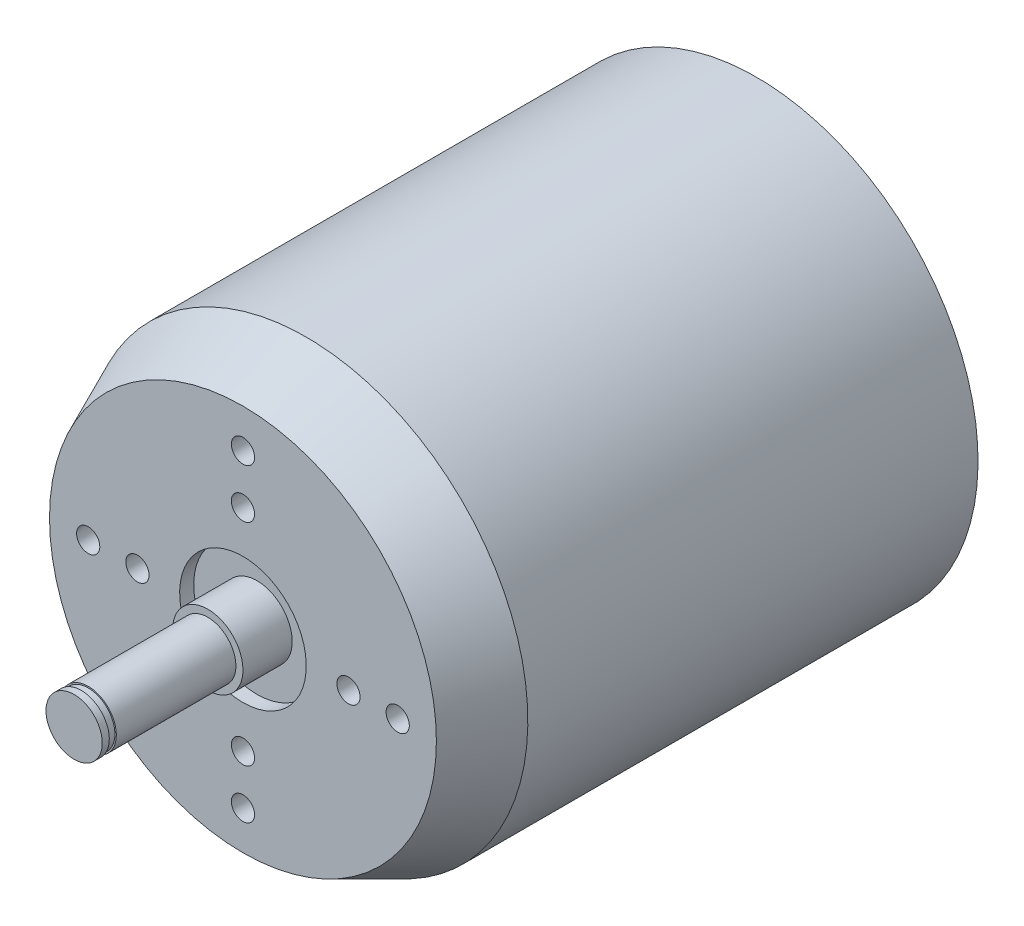
ISO-10303-21;
HEADER;
FILE_DESCRIPTION(('STEP AP214'),'2;1');
FILE_NAME('part.step','',(''),(''),'','','');
FILE_SCHEMA(('AUTOMOTIVE_DESIGN { 1 0 10303 214 1 1 1 1 }'));
ENDSEC;
DATA;
#1=APPLICATION_CONTEXT('core data for automotive mechanical design processes');
#2=APPLICATION_PROTOCOL_DEFINITION('international standard','automotive_design',2000,#1);
#3=PRODUCT_CONTEXT('',#1,'mechanical');
#4=PRODUCT('Part','Part','',(#3));
#5=PRODUCT_RELATED_PRODUCT_CATEGORY('part','',(#4));
#6=PRODUCT_DEFINITION_FORMATION('','',#4);
#7=PRODUCT_DEFINITION_CONTEXT('part definition',#1,'design');
#8=PRODUCT_DEFINITION('design','',#6,#7);
#9=PRODUCT_DEFINITION_SHAPE('','',#8);
#10=(LENGTH_UNIT() NAMED_UNIT(*) SI_UNIT(.MILLI.,.METRE.));
#11=(NAMED_UNIT(*) PLANE_ANGLE_UNIT() SI_UNIT($,.RADIAN.));
#12=(NAMED_UNIT(*) SI_UNIT($,.STERADIAN.) SOLID_ANGLE_UNIT());
#13=UNCERTAINTY_MEASURE_WITH_UNIT(LENGTH_MEASURE(1.E-05),#10,'distance_accuracy_value','');
#14=(GEOMETRIC_REPRESENTATION_CONTEXT(3) GLOBAL_UNCERTAINTY_ASSIGNED_CONTEXT((#13)) GLOBAL_UNIT_ASSIGNED_CONTEXT((#10,
#11,#12)) REPRESENTATION_CONTEXT('',''));
#15=CARTESIAN_POINT('',(0.,0.,0.));
#16=DIRECTION('',(0.,0.,1.));
#17=DIRECTION('',(1.,0.,0.));
#18=AXIS2_PLACEMENT_3D('',#15,#16,#17);
#19=CARTESIAN_POINT('',(0.,0.,23.));
#20=DIRECTION('',(0.,0.,1.));
#21=DIRECTION('',(0.,-1.,0.));
#22=AXIS2_PLACEMENT_3D('',#19,#20,#21);
#23=PLANE('',#22);
#24=CARTESIAN_POINT('',(0.,0.,23.));
#25=DIRECTION('',(0.,0.,1.));
#26=DIRECTION('',(0.,-1.,0.));
#27=AXIS2_PLACEMENT_3D('',#24,#25,#26);
#28=CIRCLE('',#27,4.);
#29=CARTESIAN_POINT('',(0.,-4.,23.));
#30=VERTEX_POINT('',#29);
#31=EDGE_CURVE('E11',#30,#30,#28,.T.);
#32=ORIENTED_EDGE('',*,*,#31,.F.);
#33=EDGE_LOOP('',(#32));
#34=FACE_BOUND('',#33,.T.);
#35=CARTESIAN_POINT('',(0.,0.,23.));
#36=DIRECTION('',(0.,0.,1.));
#37=DIRECTION('',(0.,-1.,0.));
#38=AXIS2_PLACEMENT_3D('',#35,#36,#37);
#39=CIRCLE('',#38,3.8);
#40=CARTESIAN_POINT('',(0.,-3.8,23.));
#41=VERTEX_POINT('',#40);
#42=EDGE_CURVE('E151',#41,#41,#39,.T.);
#43=ORIENTED_EDGE('',*,*,#42,.T.);
#44=EDGE_LOOP('',(#43));
#45=FACE_BOUND('',#44,.T.);
#46=ADVANCED_FACE('F45',(#34,#45),#23,.F.);
#47=CARTESIAN_POINT('',(0.,0.,-2.));
#48=DIRECTION('',(0.,0.,1.));
#49=DIRECTION('',(0.,-1.,0.));
#50=AXIS2_PLACEMENT_3D('',#47,#48,#49);
#51=CYLINDRICAL_SURFACE('',#50,4.);
#52=CARTESIAN_POINT('',(0.,0.,24.));
#53=DIRECTION('',(0.,0.,1.));
#54=DIRECTION('',(0.,-1.,0.));
#55=AXIS2_PLACEMENT_3D('',#52,#53,#54);
#56=CIRCLE('',#55,4.);
#57=CARTESIAN_POINT('',(0.,-4.,24.));
#58=VERTEX_POINT('',#57);
#59=EDGE_CURVE('E53',#58,#58,#56,.T.);
#60=ORIENTED_EDGE('',*,*,#59,.F.);
#61=EDGE_LOOP('',(#60));
#62=FACE_BOUND('',#61,.T.);
#63=ORIENTED_EDGE('',*,*,#31,.T.);
#64=EDGE_LOOP('',(#63));
#65=FACE_BOUND('',#64,.T.);
#66=ADVANCED_FACE('F208',(#62,#65),#51,.T.);
#67=CARTESIAN_POINT('',(0.,0.,24.));
#68=DIRECTION('',(0.,0.,-1.));
#69=DIRECTION('',(0.,1.,0.));
#70=AXIS2_PLACEMENT_3D('',#67,#68,#69);
#71=PLANE('',#70);
#72=ORIENTED_EDGE('',*,*,#59,.T.);
#73=EDGE_LOOP('',(#72));
#74=FACE_BOUND('',#73,.T.);
#75=ADVANCED_FACE('F206',(#74),#71,.F.);
#76=CARTESIAN_POINT('',(0.,0.,-74.));
#77=DIRECTION('',(0.,0.,-1.));
#78=DIRECTION('',(0.,1.,0.));
#79=AXIS2_PLACEMENT_3D('',#76,#77,#78);
#80=PLANE('',#79);
#81=CARTESIAN_POINT('',(0.,0.,-74.));
#82=DIRECTION('',(0.,0.,1.));
#83=DIRECTION('',(0.,-1.,0.));
#84=AXIS2_PLACEMENT_3D('',#81,#82,#83);
#85=CIRCLE('',#84,15.);
#86=CARTESIAN_POINT('',(0.,-15.,-74.));
#87=VERTEX_POINT('',#86);
#88=EDGE_CURVE('E199',#87,#87,#85,.T.);
#89=ORIENTED_EDGE('',*,*,#88,.F.);
#90=EDGE_LOOP('',(#89));
#91=FACE_BOUND('',#90,.T.);
#92=ADVANCED_FACE('F285',(#91),#80,.T.);
#93=CARTESIAN_POINT('',(0.,0.,-2.));
#94=DIRECTION('',(0.,0.,1.));
#95=DIRECTION('',(0.,-1.,0.));
#96=AXIS2_PLACEMENT_3D('',#93,#94,#95);
#97=CYLINDRICAL_SURFACE('',#96,15.);
#98=ORIENTED_EDGE('',*,*,#88,.T.);
#99=EDGE_LOOP('',(#98));
#100=FACE_BOUND('',#99,.T.);
#101=CARTESIAN_POINT('',(0.,0.,-73.));
#102=DIRECTION('',(0.,0.,1.));
#103=DIRECTION('',(0.,-1.,0.));
#104=AXIS2_PLACEMENT_3D('',#101,#102,#103);
#105=CIRCLE('',#104,15.);
#106=CARTESIAN_POINT('',(0.,-15.,-73.));
#107=VERTEX_POINT('',#106);
#108=EDGE_CURVE('E195',#107,#107,#105,.T.);
#109=ORIENTED_EDGE('',*,*,#108,.F.);
#110=EDGE_LOOP('',(#109));
#111=FACE_BOUND('',#110,.T.);
#112=ADVANCED_FACE('F281',(#100,#111),#97,.T.);
#113=CARTESIAN_POINT('',(0.,0.,-73.));
#114=DIRECTION('',(0.,0.,-1.));
#115=DIRECTION('',(0.,1.,0.));
#116=AXIS2_PLACEMENT_3D('',#113,#114,#115);
#117=PLANE('',#116);
#118=ORIENTED_EDGE('',*,*,#108,.T.);
#119=EDGE_LOOP('',(#118));
#120=FACE_BOUND('',#119,.T.);
#121=CARTESIAN_POINT('',(0.,0.,-73.));
#122=DIRECTION('',(0.,0.,1.));
#123=DIRECTION('',(0.,-1.,0.));
#124=AXIS2_PLACEMENT_3D('',#121,#122,#123);
#125=CIRCLE('',#124,31.5);
#126=CARTESIAN_POINT('',(0.,-31.5,-73.));
#127=VERTEX_POINT('',#126);
#128=EDGE_CURVE('E191',#127,#127,#125,.T.);
#129=ORIENTED_EDGE('',*,*,#128,.F.);
#130=EDGE_LOOP('',(#129));
#131=FACE_BOUND('',#130,.T.);
#132=ADVANCED_FACE('F275',(#120,#131),#117,.T.);
#133=CARTESIAN_POINT('',(0.,0.,-2.));
#134=DIRECTION('',(0.,0.,1.));
#135=DIRECTION('',(0.,-1.,0.));
#136=AXIS2_PLACEMENT_3D('',#133,#134,#135);
#137=CYLINDRICAL_SURFACE('',#136,31.5);
#138=ORIENTED_EDGE('',*,*,#128,.T.);
#139=EDGE_LOOP('',(#138));
#140=FACE_BOUND('',#139,.T.);
#141=CARTESIAN_POINT('',(0.,0.,-9.));
#142=DIRECTION('',(0.,0.,1.));
#143=DIRECTION('',(0.,-1.,0.));
#144=AXIS2_PLACEMENT_3D('',#141,#142,#143);
#145=CIRCLE('',#144,31.5);
#146=CARTESIAN_POINT('',(0.,-31.5,-9.));
#147=VERTEX_POINT('',#146);
#148=EDGE_CURVE('E187',#147,#147,#145,.T.);
#149=ORIENTED_EDGE('',*,*,#148,.F.);
#150=EDGE_LOOP('',(#149));
#151=FACE_BOUND('',#150,.T.);
#152=ADVANCED_FACE('F269',(#140,#151),#137,.T.);
#153=CARTESIAN_POINT('',(0.,0.,0.));
#154=DIRECTION('',(0.,0.,-1.));
#155=DIRECTION('',(0.,1.,0.));
#156=AXIS2_PLACEMENT_3D('',#153,#154,#155);
#157=CONICAL_SURFACE('',#156,27.5,0.418224329579228);
#158=ORIENTED_EDGE('',*,*,#148,.T.);
#159=EDGE_LOOP('',(#158));
#160=FACE_BOUND('',#159,.T.);
#161=CARTESIAN_POINT('',(0.,0.,0.));
#162=DIRECTION('',(0.,0.,1.));
#163=DIRECTION('',(0.,-1.,0.));
#164=AXIS2_PLACEMENT_3D('',#161,#162,#163);
#165=CIRCLE('',#164,27.5);
#166=CARTESIAN_POINT('',(0.,-27.5,0.));
#167=VERTEX_POINT('',#166);
#168=EDGE_CURVE('E183',#167,#167,#165,.T.);
#169=ORIENTED_EDGE('',*,*,#168,.F.);
#170=EDGE_LOOP('',(#169));
#171=FACE_BOUND('',#170,.T.);
#172=ADVANCED_FACE('F263',(#160,#171),#157,.T.);
#173=CARTESIAN_POINT('',(0.,0.,0.));
#174=DIRECTION('',(0.,0.,-1.));
#175=DIRECTION('',(0.,1.,0.));
#176=AXIS2_PLACEMENT_3D('',#173,#174,#175);
#177=PLANE('',#176);
#178=CARTESIAN_POINT('',(0.,22.,0.));
#179=DIRECTION('',(0.,0.,1.));
#180=DIRECTION('',(0.,-1.,0.));
#181=AXIS2_PLACEMENT_3D('',#178,#179,#180);
#182=CIRCLE('',#181,1.64999999999999);
#183=CARTESIAN_POINT('',(0.,20.35,0.));
#184=VERTEX_POINT('',#183);
#185=EDGE_CURVE('E90',#184,#184,#182,.T.);
#186=ORIENTED_EDGE('',*,*,#185,.F.);
#187=EDGE_LOOP('',(#186));
#188=FACE_BOUND('',#187,.T.);
#189=CARTESIAN_POINT('',(0.,15.,0.));
#190=DIRECTION('',(0.,0.,1.));
#191=DIRECTION('',(0.,-1.,0.));
#192=AXIS2_PLACEMENT_3D('',#189,#190,#191);
#193=CIRCLE('',#192,1.64999999999999);
#194=CARTESIAN_POINT('',(0.,13.35,0.));
#195=VERTEX_POINT('',#194);
#196=EDGE_CURVE('E89',#195,#195,#193,.T.);
#197=ORIENTED_EDGE('',*,*,#196,.F.);
#198=EDGE_LOOP('',(#197));
#199=FACE_BOUND('',#198,.T.);
#200=CARTESIAN_POINT('',(15.,0.,0.));
#201=DIRECTION('',(0.,0.,1.));
#202=DIRECTION('',(0.,-1.,0.));
#203=AXIS2_PLACEMENT_3D('',#200,#201,#202);
#204=CIRCLE('',#203,1.64999999999999);
#205=CARTESIAN_POINT('',(15.,-1.64999999999999,0.));
#206=VERTEX_POINT('',#205);
#207=EDGE_CURVE('E103',#206,#206,#204,.T.);
#208=ORIENTED_EDGE('',*,*,#207,.F.);
#209=EDGE_LOOP('',(#208));
#210=FACE_BOUND('',#209,.T.);
#211=CARTESIAN_POINT('',(22.,0.,0.));
#212=DIRECTION('',(0.,0.,1.));
#213=DIRECTION('',(0.,-1.,0.));
#214=AXIS2_PLACEMENT_3D('',#211,#212,#213);
#215=CIRCLE('',#214,1.64999999999999);
#216=CARTESIAN_POINT('',(22.,-1.64999999999999,0.));
#217=VERTEX_POINT('',#216);
#218=EDGE_CURVE('E111',#217,#217,#215,.T.);
#219=ORIENTED_EDGE('',*,*,#218,.F.);
#220=EDGE_LOOP('',(#219));
#221=FACE_BOUND('',#220,.T.);
#222=CARTESIAN_POINT('',(0.,-15.,0.));
#223=DIRECTION('',(0.,0.,1.));
#224=DIRECTION('',(0.,-1.,0.));
#225=AXIS2_PLACEMENT_3D('',#222,#223,#224);
#226=CIRCLE('',#225,1.64999999999999);
#227=CARTESIAN_POINT('',(0.,-16.65,0.));
#228=VERTEX_POINT('',#227);
#229=EDGE_CURVE('E119',#228,#228,#226,.T.);
#230=ORIENTED_EDGE('',*,*,#229,.F.);
#231=EDGE_LOOP('',(#230));
#232=FACE_BOUND('',#231,.T.);
#233=CARTESIAN_POINT('',(0.,-22.,0.));
#234=DIRECTION('',(0.,0.,1.));
#235=DIRECTION('',(0.,-1.,0.));
#236=AXIS2_PLACEMENT_3D('',#233,#234,#235);
#237=CIRCLE('',#236,1.64999999999999);
#238=CARTESIAN_POINT('',(0.,-23.65,0.));
#239=VERTEX_POINT('',#238);
#240=EDGE_CURVE('E127',#239,#239,#237,.T.);
#241=ORIENTED_EDGE('',*,*,#240,.F.);
#242=EDGE_LOOP('',(#241));
#243=FACE_BOUND('',#242,.T.);
#244=CARTESIAN_POINT('',(-15.,0.,0.));
#245=DIRECTION('',(0.,0.,1.));
#246=DIRECTION('',(0.,-1.,0.));
#247=AXIS2_PLACEMENT_3D('',#244,#245,#246);
#248=CIRCLE('',#247,1.64999999999999);
#249=CARTESIAN_POINT('',(-15.,-1.64999999999999,0.));
#250=VERTEX_POINT('',#249);
#251=EDGE_CURVE('E135',#250,#250,#248,.T.);
#252=ORIENTED_EDGE('',*,*,#251,.F.);
#253=EDGE_LOOP('',(#252));
#254=FACE_BOUND('',#253,.T.);
#255=CARTESIAN_POINT('',(-22.,0.,0.));
#256=DIRECTION('',(0.,0.,1.));
#257=DIRECTION('',(0.,-1.,0.));
#258=AXIS2_PLACEMENT_3D('',#255,#256,#257);
#259=CIRCLE('',#258,1.64999999999999);
#260=CARTESIAN_POINT('',(-22.,-1.65,0.));
#261=VERTEX_POINT('',#260);
#262=EDGE_CURVE('E143',#261,#261,#259,.T.);
#263=ORIENTED_EDGE('',*,*,#262,.F.);
#264=EDGE_LOOP('',(#263));
#265=FACE_BOUND('',#264,.T.);
#266=CARTESIAN_POINT('',(0.,0.,0.));
#267=DIRECTION('',(0.,0.,1.));
#268=DIRECTION('',(0.,-1.,0.));
#269=AXIS2_PLACEMENT_3D('',#266,#267,#268);
#270=CIRCLE('',#269,9.);
#271=CARTESIAN_POINT('',(0.,-9.,0.));
#272=VERTEX_POINT('',#271);
#273=EDGE_CURVE('E179',#272,#272,#270,.T.);
#274=ORIENTED_EDGE('',*,*,#273,.F.);
#275=EDGE_LOOP('',(#274));
#276=FACE_BOUND('',#275,.T.);
#277=ORIENTED_EDGE('',*,*,#168,.T.);
#278=EDGE_LOOP('',(#277));
#279=FACE_BOUND('',#278,.T.);
#280=ADVANCED_FACE('F257',(#188,#199,#210,#221,#232,#243,#254,#265,#276,#279),#177,.F.);
#281=CARTESIAN_POINT('',(0.,0.,-2.));
#282=DIRECTION('',(0.,0.,1.));
#283=DIRECTION('',(0.,-1.,0.));
#284=AXIS2_PLACEMENT_3D('',#281,#282,#283);
#285=CYLINDRICAL_SURFACE('',#284,9.);
#286=CARTESIAN_POINT('',(0.,0.,-2.));
#287=DIRECTION('',(0.,0.,1.));
#288=DIRECTION('',(0.,-1.,0.));
#289=AXIS2_PLACEMENT_3D('',#286,#287,#288);
#290=CIRCLE('',#289,9.);
#291=CARTESIAN_POINT('',(0.,-9.,-2.));
#292=VERTEX_POINT('',#291);
#293=EDGE_CURVE('E175',#292,#292,#290,.T.);
#294=ORIENTED_EDGE('',*,*,#293,.F.);
#295=EDGE_LOOP('',(#294));
#296=FACE_BOUND('',#295,.T.);
#297=ORIENTED_EDGE('',*,*,#273,.T.);
#298=EDGE_LOOP('',(#297));
#299=FACE_BOUND('',#298,.T.);
#300=ADVANCED_FACE('F251',(#296,#299),#285,.F.);
#301=CARTESIAN_POINT('',(0.,0.,-2.));
#302=DIRECTION('',(0.,0.,-1.));
#303=DIRECTION('',(0.,1.,0.));
#304=AXIS2_PLACEMENT_3D('',#301,#302,#303);
#305=PLANE('',#304);
#306=CARTESIAN_POINT('',(0.,0.,-2.));
#307=DIRECTION('',(0.,0.,1.));
#308=DIRECTION('',(0.,-1.,0.));
#309=AXIS2_PLACEMENT_3D('',#306,#307,#308);
#310=CIRCLE('',#309,5.00000000000001);
#311=CARTESIAN_POINT('',(0.,-5.00000000000001,-2.));
#312=VERTEX_POINT('',#311);
#313=EDGE_CURVE('E171',#312,#312,#310,.T.);
#314=ORIENTED_EDGE('',*,*,#313,.F.);
#315=EDGE_LOOP('',(#314));
#316=FACE_BOUND('',#315,.T.);
#317=ORIENTED_EDGE('',*,*,#293,.T.);
#318=EDGE_LOOP('',(#317));
#319=FACE_BOUND('',#318,.T.);
#320=ADVANCED_FACE('F245',(#316,#319),#305,.F.);
#321=CARTESIAN_POINT('',(0.,0.,-2.));
#322=DIRECTION('',(0.,0.,1.));
#323=DIRECTION('',(0.,-1.,0.));
#324=AXIS2_PLACEMENT_3D('',#321,#322,#323);
#325=CYLINDRICAL_SURFACE('',#324,5.00000000000001);
#326=CARTESIAN_POINT('',(0.,0.,5.));
#327=DIRECTION('',(0.,0.,1.));
#328=DIRECTION('',(0.,-1.,0.));
#329=AXIS2_PLACEMENT_3D('',#326,#327,#328);
#330=CIRCLE('',#329,5.00000000000001);
#331=CARTESIAN_POINT('',(0.,-5.00000000000001,5.));
#332=VERTEX_POINT('',#331);
#333=EDGE_CURVE('E167',#332,#332,#330,.T.);
#334=ORIENTED_EDGE('',*,*,#333,.F.);
#335=EDGE_LOOP('',(#334));
#336=FACE_BOUND('',#335,.T.);
#337=ORIENTED_EDGE('',*,*,#313,.T.);
#338=EDGE_LOOP('',(#337));
#339=FACE_BOUND('',#338,.T.);
#340=ADVANCED_FACE('F239',(#336,#339),#325,.T.);
#341=CARTESIAN_POINT('',(0.,0.,5.));
#342=DIRECTION('',(0.,0.,-1.));
#343=DIRECTION('',(0.,1.,0.));
#344=AXIS2_PLACEMENT_3D('',#341,#342,#343);
#345=PLANE('',#344);
#346=CARTESIAN_POINT('',(0.,0.,5.));
#347=DIRECTION('',(0.,0.,1.));
#348=DIRECTION('',(0.,-1.,0.));
#349=AXIS2_PLACEMENT_3D('',#346,#347,#348);
#350=CIRCLE('',#349,4.00000000000001);
#351=CARTESIAN_POINT('',(0.,-4.00000000000001,5.));
#352=VERTEX_POINT('',#351);
#353=EDGE_CURVE('E163',#352,#352,#350,.T.);
#354=ORIENTED_EDGE('',*,*,#353,.F.);
#355=EDGE_LOOP('',(#354));
#356=FACE_BOUND('',#355,.T.);
#357=ORIENTED_EDGE('',*,*,#333,.T.);
#358=EDGE_LOOP('',(#357));
#359=FACE_BOUND('',#358,.T.);
#360=ADVANCED_FACE('F233',(#356,#359),#345,.F.);
#361=CARTESIAN_POINT('',(0.,0.,-2.));
#362=DIRECTION('',(0.,0.,1.));
#363=DIRECTION('',(0.,-1.,0.));
#364=AXIS2_PLACEMENT_3D('',#361,#362,#363);
#365=CYLINDRICAL_SURFACE('',#364,4.);
#366=CARTESIAN_POINT('',(0.,0.,22.));
#367=DIRECTION('',(0.,0.,1.));
#368=DIRECTION('',(0.,-1.,0.));
#369=AXIS2_PLACEMENT_3D('',#366,#367,#368);
#370=CIRCLE('',#369,4.);
#371=CARTESIAN_POINT('',(0.,-4.,22.));
#372=VERTEX_POINT('',#371);
#373=EDGE_CURVE('E159',#372,#372,#370,.T.);
#374=ORIENTED_EDGE('',*,*,#373,.F.);
#375=EDGE_LOOP('',(#374));
#376=FACE_BOUND('',#375,.T.);
#377=ORIENTED_EDGE('',*,*,#353,.T.);
#378=EDGE_LOOP('',(#377));
#379=FACE_BOUND('',#378,.T.);
#380=ADVANCED_FACE('F227',(#376,#379),#365,.T.);
#381=CARTESIAN_POINT('',(0.,0.,22.));
#382=DIRECTION('',(0.,0.,-1.));
#383=DIRECTION('',(0.,1.,0.));
#384=AXIS2_PLACEMENT_3D('',#381,#382,#383);
#385=PLANE('',#384);
#386=CARTESIAN_POINT('',(0.,0.,22.));
#387=DIRECTION('',(0.,0.,1.));
#388=DIRECTION('',(0.,-1.,0.));
#389=AXIS2_PLACEMENT_3D('',#386,#387,#388);
#390=CIRCLE('',#389,3.8);
#391=CARTESIAN_POINT('',(0.,-3.8,22.));
#392=VERTEX_POINT('',#391);
#393=EDGE_CURVE('E155',#392,#392,#390,.T.);
#394=ORIENTED_EDGE('',*,*,#393,.F.);
#395=EDGE_LOOP('',(#394));
#396=FACE_BOUND('',#395,.T.);
#397=ORIENTED_EDGE('',*,*,#373,.T.);
#398=EDGE_LOOP('',(#397));
#399=FACE_BOUND('',#398,.T.);
#400=ADVANCED_FACE('F221',(#396,#399),#385,.F.);
#401=CARTESIAN_POINT('',(0.,0.,-2.));
#402=DIRECTION('',(0.,0.,1.));
#403=DIRECTION('',(0.,-1.,0.));
#404=AXIS2_PLACEMENT_3D('',#401,#402,#403);
#405=CYLINDRICAL_SURFACE('',#404,3.8);
#406=ORIENTED_EDGE('',*,*,#42,.F.);
#407=EDGE_LOOP('',(#406));
#408=FACE_BOUND('',#407,.T.);
#409=ORIENTED_EDGE('',*,*,#393,.T.);
#410=EDGE_LOOP('',(#409));
#411=FACE_BOUND('',#410,.T.);
#412=ADVANCED_FACE('F217',(#408,#411),#405,.T.);
#413=CARTESIAN_POINT('',(-22.,0.,-5.));
#414=DIRECTION('',(0.,0.,1.));
#415=DIRECTION('',(0.,-1.,0.));
#416=AXIS2_PLACEMENT_3D('',#413,#414,#415);
#417=CONICAL_SURFACE('',#416,1.64999999999999,1.02974425867665);
#418=CARTESIAN_POINT('',(-22.,0.,-5.99142002139547));
#419=VERTEX_POINT('',#418);
#420=VERTEX_LOOP('',#419);
#421=FACE_BOUND('',#420,.T.);
#422=CARTESIAN_POINT('',(-22.,0.,-5.));
#423=DIRECTION('',(0.,0.,1.));
#424=DIRECTION('',(0.,-1.,0.));
#425=AXIS2_PLACEMENT_3D('',#422,#423,#424);
#426=CIRCLE('',#425,1.64999999999999);
#427=CARTESIAN_POINT('',(-22.,-1.64999999999999,-5.));
#428=VERTEX_POINT('',#427);
#429=EDGE_CURVE('E147',#428,#428,#426,.T.);
#430=ORIENTED_EDGE('',*,*,#429,.T.);
#431=EDGE_LOOP('',(#430));
#432=FACE_BOUND('',#431,.T.);
#433=ADVANCED_FACE('F220',(#421,#432),#417,.F.);
#434=CARTESIAN_POINT('',(-22.,0.,0.));
#435=DIRECTION('',(0.,0.,1.));
#436=DIRECTION('',(0.,-1.,0.));
#437=AXIS2_PLACEMENT_3D('',#434,#435,#436);
#438=CYLINDRICAL_SURFACE('',#437,1.64999999999999);
#439=ORIENTED_EDGE('',*,*,#429,.F.);
#440=EDGE_LOOP('',(#439));
#441=FACE_BOUND('',#440,.T.);
#442=ORIENTED_EDGE('',*,*,#262,.T.);
#443=EDGE_LOOP('',(#442));
#444=FACE_BOUND('',#443,.T.);
#445=ADVANCED_FACE('F372',(#441,#444),#438,.F.);
#446=CARTESIAN_POINT('',(-15.,0.,-5.));
#447=DIRECTION('',(0.,0.,1.));
#448=DIRECTION('',(0.,-1.,0.));
#449=AXIS2_PLACEMENT_3D('',#446,#447,#448);
#450=CONICAL_SURFACE('',#449,1.64999999999999,1.02974425867665);
#451=CARTESIAN_POINT('',(-15.,0.,-5.99142002139547));
#452=VERTEX_POINT('',#451);
#453=VERTEX_LOOP('',#452);
#454=FACE_BOUND('',#453,.T.);
#455=CARTESIAN_POINT('',(-15.,0.,-5.));
#456=DIRECTION('',(0.,0.,1.));
#457=DIRECTION('',(0.,-1.,0.));
#458=AXIS2_PLACEMENT_3D('',#455,#456,#457);
#459=CIRCLE('',#458,1.64999999999999);
#460=CARTESIAN_POINT('',(-15.,-1.64999999999999,-5.));
#461=VERTEX_POINT('',#460);
#462=EDGE_CURVE('E139',#461,#461,#459,.T.);
#463=ORIENTED_EDGE('',*,*,#462,.T.);
#464=EDGE_LOOP('',(#463));
#465=FACE_BOUND('',#464,.T.);
#466=ADVANCED_FACE('F381',(#454,#465),#450,.F.);
#467=CARTESIAN_POINT('',(-15.,0.,0.));
#468=DIRECTION('',(0.,0.,1.));
#469=DIRECTION('',(0.,-1.,0.));
#470=AXIS2_PLACEMENT_3D('',#467,#468,#469);
#471=CYLINDRICAL_SURFACE('',#470,1.64999999999999);
#472=ORIENTED_EDGE('',*,*,#462,.F.);
#473=EDGE_LOOP('',(#472));
#474=FACE_BOUND('',#473,.T.);
#475=ORIENTED_EDGE('',*,*,#251,.T.);
#476=EDGE_LOOP('',(#475));
#477=FACE_BOUND('',#476,.T.);
#478=ADVANCED_FACE('F391',(#474,#477),#471,.F.);
#479=CARTESIAN_POINT('',(0.,-22.,-5.));
#480=DIRECTION('',(0.,0.,1.));
#481=DIRECTION('',(0.,-1.,0.));
#482=AXIS2_PLACEMENT_3D('',#479,#480,#481);
#483=CONICAL_SURFACE('',#482,1.64999999999999,1.02974425867665);
#484=CARTESIAN_POINT('',(0.,-22.,-5.99142002139547));
#485=VERTEX_POINT('',#484);
#486=VERTEX_LOOP('',#485);
#487=FACE_BOUND('',#486,.T.);
#488=CARTESIAN_POINT('',(0.,-22.,-5.));
#489=DIRECTION('',(0.,0.,1.));
#490=DIRECTION('',(0.,-1.,0.));
#491=AXIS2_PLACEMENT_3D('',#488,#489,#490);
#492=CIRCLE('',#491,1.64999999999999);
#493=CARTESIAN_POINT('',(0.,-23.65,-5.));
#494=VERTEX_POINT('',#493);
#495=EDGE_CURVE('E131',#494,#494,#492,.T.);
#496=ORIENTED_EDGE('',*,*,#495,.T.);
#497=EDGE_LOOP('',(#496));
#498=FACE_BOUND('',#497,.T.);
#499=ADVANCED_FACE('F400',(#487,#498),#483,.F.);
#500=CARTESIAN_POINT('',(0.,-22.,0.));
#501=DIRECTION('',(0.,0.,1.));
#502=DIRECTION('',(0.,-1.,0.));
#503=AXIS2_PLACEMENT_3D('',#500,#501,#502);
#504=CYLINDRICAL_SURFACE('',#503,1.64999999999999);
#505=ORIENTED_EDGE('',*,*,#495,.F.);
#506=EDGE_LOOP('',(#505));
#507=FACE_BOUND('',#506,.T.);
#508=ORIENTED_EDGE('',*,*,#240,.T.);
#509=EDGE_LOOP('',(#508));
#510=FACE_BOUND('',#509,.T.);
#511=ADVANCED_FACE('F410',(#507,#510),#504,.F.);
#512=CARTESIAN_POINT('',(0.,-15.,-5.));
#513=DIRECTION('',(0.,0.,1.));
#514=DIRECTION('',(0.,-1.,0.));
#515=AXIS2_PLACEMENT_3D('',#512,#513,#514);
#516=CONICAL_SURFACE('',#515,1.64999999999999,1.02974425867665);
#517=CARTESIAN_POINT('',(0.,-15.,-5.99142002139547));
#518=VERTEX_POINT('',#517);
#519=VERTEX_LOOP('',#518);
#520=FACE_BOUND('',#519,.T.);
#521=CARTESIAN_POINT('',(0.,-15.,-5.));
#522=DIRECTION('',(0.,0.,1.));
#523=DIRECTION('',(0.,-1.,0.));
#524=AXIS2_PLACEMENT_3D('',#521,#522,#523);
#525=CIRCLE('',#524,1.64999999999999);
#526=CARTESIAN_POINT('',(0.,-16.65,-5.));
#527=VERTEX_POINT('',#526);
#528=EDGE_CURVE('E123',#527,#527,#525,.T.);
#529=ORIENTED_EDGE('',*,*,#528,.T.);
#530=EDGE_LOOP('',(#529));
#531=FACE_BOUND('',#530,.T.);
#532=ADVANCED_FACE('F420',(#520,#531),#516,.F.);
#533=CARTESIAN_POINT('',(0.,-15.,0.));
#534=DIRECTION('',(0.,0.,1.));
#535=DIRECTION('',(0.,-1.,0.));
#536=AXIS2_PLACEMENT_3D('',#533,#534,#535);
#537=CYLINDRICAL_SURFACE('',#536,1.64999999999999);
#538=ORIENTED_EDGE('',*,*,#528,.F.);
#539=EDGE_LOOP('',(#538));
#540=FACE_BOUND('',#539,.T.);
#541=ORIENTED_EDGE('',*,*,#229,.T.);
#542=EDGE_LOOP('',(#541));
#543=FACE_BOUND('',#542,.T.);
#544=ADVANCED_FACE('F430',(#540,#543),#537,.F.);
#545=CARTESIAN_POINT('',(22.,0.,-5.));
#546=DIRECTION('',(0.,0.,1.));
#547=DIRECTION('',(0.,-1.,0.));
#548=AXIS2_PLACEMENT_3D('',#545,#546,#547);
#549=CONICAL_SURFACE('',#548,1.64999999999999,1.02974425867665);
#550=CARTESIAN_POINT('',(22.,0.,-5.99142002139547));
#551=VERTEX_POINT('',#550);
#552=VERTEX_LOOP('',#551);
#553=FACE_BOUND('',#552,.T.);
#554=CARTESIAN_POINT('',(22.,0.,-5.));
#555=DIRECTION('',(0.,0.,1.));
#556=DIRECTION('',(0.,-1.,0.));
#557=AXIS2_PLACEMENT_3D('',#554,#555,#556);
#558=CIRCLE('',#557,1.64999999999999);
#559=CARTESIAN_POINT('',(22.,-1.64999999999999,-5.));
#560=VERTEX_POINT('',#559);
#561=EDGE_CURVE('E115',#560,#560,#558,.T.);
#562=ORIENTED_EDGE('',*,*,#561,.T.);
#563=EDGE_LOOP('',(#562));
#564=FACE_BOUND('',#563,.T.);
#565=ADVANCED_FACE('F440',(#553,#564),#549,.F.);
#566=CARTESIAN_POINT('',(22.,0.,0.));
#567=DIRECTION('',(0.,0.,1.));
#568=DIRECTION('',(0.,-1.,0.));
#569=AXIS2_PLACEMENT_3D('',#566,#567,#568);
#570=CYLINDRICAL_SURFACE('',#569,1.64999999999999);
#571=ORIENTED_EDGE('',*,*,#561,.F.);
#572=EDGE_LOOP('',(#571));
#573=FACE_BOUND('',#572,.T.);
#574=ORIENTED_EDGE('',*,*,#218,.T.);
#575=EDGE_LOOP('',(#574));
#576=FACE_BOUND('',#575,.T.);
#577=ADVANCED_FACE('F450',(#573,#576),#570,.F.);
#578=CARTESIAN_POINT('',(15.,0.,-5.));
#579=DIRECTION('',(0.,0.,1.));
#580=DIRECTION('',(0.,-1.,0.));
#581=AXIS2_PLACEMENT_3D('',#578,#579,#580);
#582=CONICAL_SURFACE('',#581,1.64999999999999,1.02974425867665);
#583=CARTESIAN_POINT('',(15.,0.,-5.99142002139547));
#584=VERTEX_POINT('',#583);
#585=VERTEX_LOOP('',#584);
#586=FACE_BOUND('',#585,.T.);
#587=CARTESIAN_POINT('',(15.,0.,-5.));
#588=DIRECTION('',(0.,0.,1.));
#589=DIRECTION('',(0.,-1.,0.));
#590=AXIS2_PLACEMENT_3D('',#587,#588,#589);
#591=CIRCLE('',#590,1.64999999999999);
#592=CARTESIAN_POINT('',(15.,-1.64999999999999,-5.));
#593=VERTEX_POINT('',#592);
#594=EDGE_CURVE('E107',#593,#593,#591,.T.);
#595=ORIENTED_EDGE('',*,*,#594,.T.);
#596=EDGE_LOOP('',(#595));
#597=FACE_BOUND('',#596,.T.);
#598=ADVANCED_FACE('F460',(#586,#597),#582,.F.);
#599=CARTESIAN_POINT('',(15.,0.,0.));
#600=DIRECTION('',(0.,0.,1.));
#601=DIRECTION('',(0.,-1.,0.));
#602=AXIS2_PLACEMENT_3D('',#599,#600,#601);
#603=CYLINDRICAL_SURFACE('',#602,1.64999999999999);
#604=ORIENTED_EDGE('',*,*,#594,.F.);
#605=EDGE_LOOP('',(#604));
#606=FACE_BOUND('',#605,.T.);
#607=ORIENTED_EDGE('',*,*,#207,.T.);
#608=EDGE_LOOP('',(#607));
#609=FACE_BOUND('',#608,.T.);
#610=ADVANCED_FACE('F470',(#606,#609),#603,.F.);
#611=CARTESIAN_POINT('',(0.,15.,-5.));
#612=DIRECTION('',(0.,0.,1.));
#613=DIRECTION('',(0.,-1.,0.));
#614=AXIS2_PLACEMENT_3D('',#611,#612,#613);
#615=CONICAL_SURFACE('',#614,1.64999999999999,1.02974425867665);
#616=CARTESIAN_POINT('',(0.,15.,-5.99142002139547));
#617=VERTEX_POINT('',#616);
#618=VERTEX_LOOP('',#617);
#619=FACE_BOUND('',#618,.T.);
#620=CARTESIAN_POINT('',(0.,15.,-5.));
#621=DIRECTION('',(0.,0.,1.));
#622=DIRECTION('',(0.,-1.,0.));
#623=AXIS2_PLACEMENT_3D('',#620,#621,#622);
#624=CIRCLE('',#623,1.64999999999999);
#625=CARTESIAN_POINT('',(0.,13.35,-5.));
#626=VERTEX_POINT('',#625);
#627=EDGE_CURVE('E95',#626,#626,#624,.T.);
#628=ORIENTED_EDGE('',*,*,#627,.T.);
#629=EDGE_LOOP('',(#628));
#630=FACE_BOUND('',#629,.T.);
#631=ADVANCED_FACE('F480',(#619,#630),#615,.F.);
#632=CARTESIAN_POINT('',(0.,15.,0.));
#633=DIRECTION('',(0.,0.,1.));
#634=DIRECTION('',(0.,-1.,0.));
#635=AXIS2_PLACEMENT_3D('',#632,#633,#634);
#636=CYLINDRICAL_SURFACE('',#635,1.64999999999999);
#637=ORIENTED_EDGE('',*,*,#627,.F.);
#638=EDGE_LOOP('',(#637));
#639=FACE_BOUND('',#638,.T.);
#640=ORIENTED_EDGE('',*,*,#196,.T.);
#641=EDGE_LOOP('',(#640));
#642=FACE_BOUND('',#641,.T.);
#643=ADVANCED_FACE('F82',(#639,#642),#636,.F.);
#644=CARTESIAN_POINT('',(0.,22.,-5.));
#645=DIRECTION('',(0.,0.,1.));
#646=DIRECTION('',(0.,-1.,0.));
#647=AXIS2_PLACEMENT_3D('',#644,#645,#646);
#648=CONICAL_SURFACE('',#647,1.64999999999999,1.02974425867665);
#649=CARTESIAN_POINT('',(0.,22.,-5.99142002139547));
#650=VERTEX_POINT('',#649);
#651=VERTEX_LOOP('',#650);
#652=FACE_BOUND('',#651,.T.);
#653=CARTESIAN_POINT('',(0.,22.,-5.));
#654=DIRECTION('',(0.,0.,1.));
#655=DIRECTION('',(0.,-1.,0.));
#656=AXIS2_PLACEMENT_3D('',#653,#654,#655);
#657=CIRCLE('',#656,1.64999999999999);
#658=CARTESIAN_POINT('',(0.,20.35,-5.));
#659=VERTEX_POINT('',#658);
#660=EDGE_CURVE('E86',#659,#659,#657,.T.);
#661=ORIENTED_EDGE('',*,*,#660,.T.);
#662=EDGE_LOOP('',(#661));
#663=FACE_BOUND('',#662,.T.);
#664=ADVANCED_FACE('F78',(#652,#663),#648,.F.);
#665=CARTESIAN_POINT('',(0.,22.,0.));
#666=DIRECTION('',(0.,0.,1.));
#667=DIRECTION('',(0.,-1.,0.));
#668=AXIS2_PLACEMENT_3D('',#665,#666,#667);
#669=CYLINDRICAL_SURFACE('',#668,1.64999999999999);
#670=ORIENTED_EDGE('',*,*,#660,.F.);
#671=EDGE_LOOP('',(#670));
#672=FACE_BOUND('',#671,.T.);
#673=ORIENTED_EDGE('',*,*,#185,.T.);
#674=EDGE_LOOP('',(#673));
#675=FACE_BOUND('',#674,.T.);
#676=ADVANCED_FACE('F81',(#672,#675),#669,.F.);
#677=CLOSED_SHELL('',(#46,#66,#75,#92,#112,#132,#152,#172,#280,#300,#320,#340,#360,#380,#400,
#412,#433,#445,#466,#478,#499,#511,#532,#544,#565,#577,#598,#610,#631,#643,#664,#676));
#678=MANIFOLD_SOLID_BREP('B2',#677);
#679=ADVANCED_BREP_SHAPE_REPRESENTATION('',(#18,#678),#14);
#680=SHAPE_DEFINITION_REPRESENTATION(#9,#679);
ENDSEC;
END-ISO-10303-21;
